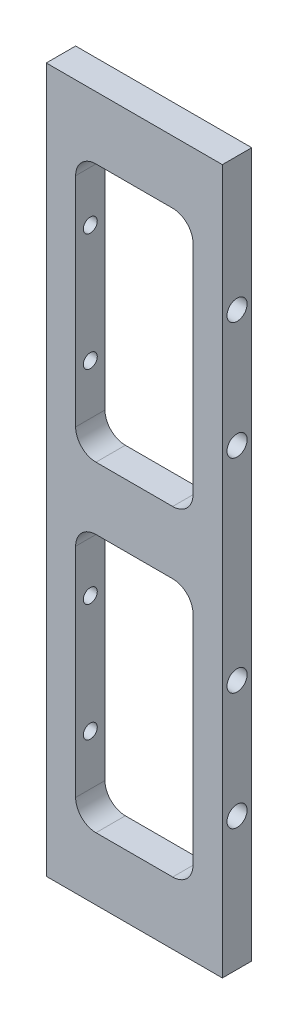
ISO-10303-21;
HEADER;
FILE_DESCRIPTION(('STEP AP214'),'2;1');
FILE_NAME('part.step','',(''),(''),'','','');
FILE_SCHEMA(('AUTOMOTIVE_DESIGN { 1 0 10303 214 1 1 1 1 }'));
ENDSEC;
DATA;
#1=APPLICATION_CONTEXT('core data for automotive mechanical design processes');
#2=APPLICATION_PROTOCOL_DEFINITION('international standard','automotive_design',2000,#1);
#3=PRODUCT_CONTEXT('',#1,'mechanical');
#4=PRODUCT('Part','Part','',(#3));
#5=PRODUCT_RELATED_PRODUCT_CATEGORY('part','',(#4));
#6=PRODUCT_DEFINITION_FORMATION('','',#4);
#7=PRODUCT_DEFINITION_CONTEXT('part definition',#1,'design');
#8=PRODUCT_DEFINITION('design','',#6,#7);
#9=PRODUCT_DEFINITION_SHAPE('','',#8);
#10=(LENGTH_UNIT() NAMED_UNIT(*) SI_UNIT(.MILLI.,.METRE.));
#11=(NAMED_UNIT(*) PLANE_ANGLE_UNIT() SI_UNIT($,.RADIAN.));
#12=(NAMED_UNIT(*) SI_UNIT($,.STERADIAN.) SOLID_ANGLE_UNIT());
#13=UNCERTAINTY_MEASURE_WITH_UNIT(LENGTH_MEASURE(1.E-05),#10,'distance_accuracy_value','');
#14=(GEOMETRIC_REPRESENTATION_CONTEXT(3) GLOBAL_UNCERTAINTY_ASSIGNED_CONTEXT((#13)) GLOBAL_UNIT_ASSIGNED_CONTEXT((#10,
#11,#12)) REPRESENTATION_CONTEXT('',''));
#15=CARTESIAN_POINT('',(0.,0.,0.));
#16=DIRECTION('',(0.,0.,1.));
#17=DIRECTION('',(1.,0.,0.));
#18=AXIS2_PLACEMENT_3D('',#15,#16,#17);
#19=CARTESIAN_POINT('',(14.2875,-57.15,4.7625));
#20=DIRECTION('',(-1.,0.,0.));
#21=DIRECTION('',(0.,0.,1.));
#22=AXIS2_PLACEMENT_3D('',#19,#20,#21);
#23=PLANE('',#22);
#24=DIRECTION('',(0.,1.,0.));
#25=VECTOR('',#24,1.);
#26=CARTESIAN_POINT('',(14.2875,-57.15,0.));
#27=LINE('',#26,#25);
#28=CARTESIAN_POINT('',(14.2875,-57.15,0.));
#29=VERTEX_POINT('',#28);
#30=CARTESIAN_POINT('',(14.2875,57.15,0.));
#31=VERTEX_POINT('',#30);
#32=EDGE_CURVE('E197',#29,#31,#27,.T.);
#33=ORIENTED_EDGE('',*,*,#32,.T.);
#34=DIRECTION('',(0.,0.,-1.));
#35=VECTOR('',#34,1.);
#36=CARTESIAN_POINT('',(14.2875,57.15,4.7625));
#37=LINE('',#36,#35);
#38=CARTESIAN_POINT('',(14.2875,57.15,4.7625));
#39=VERTEX_POINT('',#38);
#40=EDGE_CURVE('E177',#39,#31,#37,.T.);
#41=ORIENTED_EDGE('',*,*,#40,.F.);
#42=DIRECTION('',(0.,1.,0.));
#43=VECTOR('',#42,1.);
#44=CARTESIAN_POINT('',(14.2875,-57.15,4.7625));
#45=LINE('',#44,#43);
#46=CARTESIAN_POINT('',(14.2875,-57.15,4.7625));
#47=VERTEX_POINT('',#46);
#48=EDGE_CURVE('E184',#47,#39,#45,.T.);
#49=ORIENTED_EDGE('',*,*,#48,.F.);
#50=DIRECTION('',(0.,0.,-1.));
#51=VECTOR('',#50,1.);
#52=CARTESIAN_POINT('',(14.2875,-57.15,4.7625));
#53=LINE('',#52,#51);
#54=EDGE_CURVE('E308',#47,#29,#53,.T.);
#55=ORIENTED_EDGE('',*,*,#54,.T.);
#56=EDGE_LOOP('',(#33,#41,#49,#55));
#57=FACE_BOUND('',#56,.T.);
#58=CARTESIAN_POINT('',(14.2875,-35.56,2.38124999999999));
#59=DIRECTION('',(1.,0.,0.));
#60=DIRECTION('',(0.,0.,-1.));
#61=AXIS2_PLACEMENT_3D('',#58,#59,#60);
#62=CIRCLE('',#61,1.63194999999999);
#63=CARTESIAN_POINT('',(14.2875,-35.56,0.749300000000003));
#64=VERTEX_POINT('',#63);
#65=EDGE_CURVE('E410',#64,#64,#62,.T.);
#66=ORIENTED_EDGE('',*,*,#65,.F.);
#67=EDGE_LOOP('',(#66));
#68=FACE_BOUND('',#67,.T.);
#69=CARTESIAN_POINT('',(14.2875,-16.51,2.38124999999999));
#70=DIRECTION('',(1.,0.,0.));
#71=DIRECTION('',(0.,0.,-1.));
#72=AXIS2_PLACEMENT_3D('',#69,#70,#71);
#73=CIRCLE('',#72,1.63194999999999);
#74=CARTESIAN_POINT('',(14.2875,-16.51,0.749300000000003));
#75=VERTEX_POINT('',#74);
#76=EDGE_CURVE('E416',#75,#75,#73,.T.);
#77=ORIENTED_EDGE('',*,*,#76,.F.);
#78=EDGE_LOOP('',(#77));
#79=FACE_BOUND('',#78,.T.);
#80=CARTESIAN_POINT('',(14.2875,16.51,2.38125));
#81=DIRECTION('',(1.,0.,0.));
#82=DIRECTION('',(0.,0.,-1.));
#83=AXIS2_PLACEMENT_3D('',#80,#81,#82);
#84=CIRCLE('',#83,1.63194999999999);
#85=CARTESIAN_POINT('',(14.2875,16.51,0.749300000000006));
#86=VERTEX_POINT('',#85);
#87=EDGE_CURVE('E422',#86,#86,#84,.T.);
#88=ORIENTED_EDGE('',*,*,#87,.F.);
#89=EDGE_LOOP('',(#88));
#90=FACE_BOUND('',#89,.T.);
#91=CARTESIAN_POINT('',(14.2875,35.56,2.38125));
#92=DIRECTION('',(1.,0.,0.));
#93=DIRECTION('',(0.,0.,-1.));
#94=AXIS2_PLACEMENT_3D('',#91,#92,#93);
#95=CIRCLE('',#94,1.63194999999999);
#96=CARTESIAN_POINT('',(14.2875,35.56,0.749300000000011));
#97=VERTEX_POINT('',#96);
#98=EDGE_CURVE('E428',#97,#97,#95,.T.);
#99=ORIENTED_EDGE('',*,*,#98,.F.);
#100=EDGE_LOOP('',(#99));
#101=FACE_BOUND('',#100,.T.);
#102=ADVANCED_FACE('F35',(#57,#68,#79,#90,#101),#23,.F.);
#103=CARTESIAN_POINT('',(-14.2875,57.15,4.7625));
#104=DIRECTION('',(0.,-1.,0.));
#105=DIRECTION('',(0.,0.,-1.));
#106=AXIS2_PLACEMENT_3D('',#103,#104,#105);
#107=PLANE('',#106);
#108=DIRECTION('',(-1.,0.,0.));
#109=VECTOR('',#108,1.);
#110=CARTESIAN_POINT('',(-14.2875,57.15,0.));
#111=LINE('',#110,#109);
#112=CARTESIAN_POINT('',(-14.2875,57.15,0.));
#113=VERTEX_POINT('',#112);
#114=EDGE_CURVE('E310',#31,#113,#111,.T.);
#115=ORIENTED_EDGE('',*,*,#114,.T.);
#116=DIRECTION('',(0.,0.,-1.));
#117=VECTOR('',#116,1.);
#118=CARTESIAN_POINT('',(-14.2875,57.15,4.7625));
#119=LINE('',#118,#117);
#120=CARTESIAN_POINT('',(-14.2875,57.15,4.7625));
#121=VERTEX_POINT('',#120);
#122=EDGE_CURVE('E180',#121,#113,#119,.T.);
#123=ORIENTED_EDGE('',*,*,#122,.F.);
#124=DIRECTION('',(-1.,0.,0.));
#125=VECTOR('',#124,1.);
#126=CARTESIAN_POINT('',(-14.2875,57.15,4.7625));
#127=LINE('',#126,#125);
#128=EDGE_CURVE('E173',#39,#121,#127,.T.);
#129=ORIENTED_EDGE('',*,*,#128,.F.);
#130=ORIENTED_EDGE('',*,*,#40,.T.);
#131=EDGE_LOOP('',(#115,#123,#129,#130));
#132=FACE_BOUND('',#131,.T.);
#133=ADVANCED_FACE('F175',(#132),#107,.F.);
#134=CARTESIAN_POINT('',(-14.2875,-57.15,4.7625));
#135=DIRECTION('',(1.,0.,0.));
#136=DIRECTION('',(0.,0.,-1.));
#137=AXIS2_PLACEMENT_3D('',#134,#135,#136);
#138=PLANE('',#137);
#139=CARTESIAN_POINT('',(-14.2875,16.51,2.38124999999999));
#140=DIRECTION('',(-1.,0.,0.));
#141=DIRECTION('',(0.,0.,1.));
#142=AXIS2_PLACEMENT_3D('',#139,#140,#141);
#143=CIRCLE('',#142,1.13029999999999);
#144=CARTESIAN_POINT('',(-14.2875,16.51,3.51154999999998));
#145=VERTEX_POINT('',#144);
#146=EDGE_CURVE('E452',#145,#145,#143,.T.);
#147=ORIENTED_EDGE('',*,*,#146,.F.);
#148=EDGE_LOOP('',(#147));
#149=FACE_BOUND('',#148,.T.);
#150=CARTESIAN_POINT('',(-14.2875,35.56,2.38124999999999));
#151=DIRECTION('',(-1.,0.,0.));
#152=DIRECTION('',(0.,0.,1.));
#153=AXIS2_PLACEMENT_3D('',#150,#151,#152);
#154=CIRCLE('',#153,1.13029999999999);
#155=CARTESIAN_POINT('',(-14.2875,35.56,3.51154999999998));
#156=VERTEX_POINT('',#155);
#157=EDGE_CURVE('E446',#156,#156,#154,.T.);
#158=ORIENTED_EDGE('',*,*,#157,.F.);
#159=EDGE_LOOP('',(#158));
#160=FACE_BOUND('',#159,.T.);
#161=CARTESIAN_POINT('',(-14.2875,-16.51,2.38125));
#162=DIRECTION('',(-1.,0.,0.));
#163=DIRECTION('',(0.,0.,1.));
#164=AXIS2_PLACEMENT_3D('',#161,#162,#163);
#165=CIRCLE('',#164,1.13029999999999);
#166=CARTESIAN_POINT('',(-14.2875,-16.51,3.51154999999998));
#167=VERTEX_POINT('',#166);
#168=EDGE_CURVE('E440',#167,#167,#165,.T.);
#169=ORIENTED_EDGE('',*,*,#168,.F.);
#170=EDGE_LOOP('',(#169));
#171=FACE_BOUND('',#170,.T.);
#172=CARTESIAN_POINT('',(-14.2875,-35.56,2.38125));
#173=DIRECTION('',(-1.,0.,0.));
#174=DIRECTION('',(0.,0.,1.));
#175=AXIS2_PLACEMENT_3D('',#172,#173,#174);
#176=CIRCLE('',#175,1.13029999999999);
#177=CARTESIAN_POINT('',(-14.2875,-35.56,3.51154999999998));
#178=VERTEX_POINT('',#177);
#179=EDGE_CURVE('E434',#178,#178,#176,.T.);
#180=ORIENTED_EDGE('',*,*,#179,.F.);
#181=EDGE_LOOP('',(#180));
#182=FACE_BOUND('',#181,.T.);
#183=DIRECTION('',(0.,-1.,0.));
#184=VECTOR('',#183,1.);
#185=CARTESIAN_POINT('',(-14.2875,-57.15,0.));
#186=LINE('',#185,#184);
#187=CARTESIAN_POINT('',(-14.2875,-57.15,0.));
#188=VERTEX_POINT('',#187);
#189=EDGE_CURVE('E312',#113,#188,#186,.T.);
#190=ORIENTED_EDGE('',*,*,#189,.T.);
#191=DIRECTION('',(0.,0.,-1.));
#192=VECTOR('',#191,1.);
#193=CARTESIAN_POINT('',(-14.2875,-57.15,4.7625));
#194=LINE('',#193,#192);
#195=CARTESIAN_POINT('',(-14.2875,-57.15,4.7625));
#196=VERTEX_POINT('',#195);
#197=EDGE_CURVE('E202',#196,#188,#194,.T.);
#198=ORIENTED_EDGE('',*,*,#197,.F.);
#199=DIRECTION('',(0.,-1.,0.));
#200=VECTOR('',#199,1.);
#201=CARTESIAN_POINT('',(-14.2875,-57.15,4.7625));
#202=LINE('',#201,#200);
#203=EDGE_CURVE('E183',#121,#196,#202,.T.);
#204=ORIENTED_EDGE('',*,*,#203,.F.);
#205=ORIENTED_EDGE('',*,*,#122,.T.);
#206=EDGE_LOOP('',(#190,#198,#204,#205));
#207=FACE_BOUND('',#206,.T.);
#208=ADVANCED_FACE('F322',(#149,#160,#171,#182,#207),#138,.F.);
#209=CARTESIAN_POINT('',(-14.2875,-57.15,4.7625));
#210=DIRECTION('',(0.,1.,0.));
#211=DIRECTION('',(0.,0.,1.));
#212=AXIS2_PLACEMENT_3D('',#209,#210,#211);
#213=PLANE('',#212);
#214=DIRECTION('',(1.,0.,0.));
#215=VECTOR('',#214,1.);
#216=CARTESIAN_POINT('',(-14.2875,-57.15,0.));
#217=LINE('',#216,#215);
#218=EDGE_CURVE('E193',#188,#29,#217,.T.);
#219=ORIENTED_EDGE('',*,*,#218,.T.);
#220=ORIENTED_EDGE('',*,*,#54,.F.);
#221=DIRECTION('',(1.,0.,0.));
#222=VECTOR('',#221,1.);
#223=CARTESIAN_POINT('',(-14.2875,-57.15,4.7625));
#224=LINE('',#223,#222);
#225=EDGE_CURVE('E189',#196,#47,#224,.T.);
#226=ORIENTED_EDGE('',*,*,#225,.F.);
#227=ORIENTED_EDGE('',*,*,#197,.T.);
#228=EDGE_LOOP('',(#219,#220,#226,#227));
#229=FACE_BOUND('',#228,.T.);
#230=ADVANCED_FACE('F319',(#229),#213,.F.);
#231=CARTESIAN_POINT('',(0.,0.,4.7625));
#232=DIRECTION('',(0.,0.,-1.));
#233=DIRECTION('',(-1.,0.,0.));
#234=AXIS2_PLACEMENT_3D('',#231,#232,#233);
#235=PLANE('',#234);
#236=DIRECTION('',(1.,0.,0.));
#237=VECTOR('',#236,1.);
#238=CARTESIAN_POINT('',(-9.52500000000001,-46.99,4.7625));
#239=LINE('',#238,#237);
#240=CARTESIAN_POINT('',(-6.22300000000001,-46.99,4.7625));
#241=VERTEX_POINT('',#240);
#242=CARTESIAN_POINT('',(6.223,-46.99,4.7625));
#243=VERTEX_POINT('',#242);
#244=EDGE_CURVE('E391',#241,#243,#239,.T.);
#245=ORIENTED_EDGE('',*,*,#244,.F.);
#246=CARTESIAN_POINT('',(-6.22300000000001,-43.688,4.7625));
#247=DIRECTION('',(0.,0.,-1.));
#248=DIRECTION('',(-1.,0.,0.));
#249=AXIS2_PLACEMENT_3D('',#246,#247,#248);
#250=CIRCLE('',#249,3.302);
#251=CARTESIAN_POINT('',(-9.52500000000001,-43.688,4.7625));
#252=VERTEX_POINT('',#251);
#253=EDGE_CURVE('E242',#241,#252,#250,.T.);
#254=ORIENTED_EDGE('',*,*,#253,.T.);
#255=DIRECTION('',(0.,-1.,0.));
#256=VECTOR('',#255,1.);
#257=CARTESIAN_POINT('',(-9.52500000000001,-5.08,4.7625));
#258=LINE('',#257,#256);
#259=CARTESIAN_POINT('',(-9.52500000000001,-8.382,4.7625));
#260=VERTEX_POINT('',#259);
#261=EDGE_CURVE('E394',#260,#252,#258,.T.);
#262=ORIENTED_EDGE('',*,*,#261,.F.);
#263=CARTESIAN_POINT('',(-6.22300000000001,-8.382,4.7625));
#264=DIRECTION('',(0.,0.,-1.));
#265=DIRECTION('',(-1.,0.,0.));
#266=AXIS2_PLACEMENT_3D('',#263,#264,#265);
#267=CIRCLE('',#266,3.302);
#268=CARTESIAN_POINT('',(-6.22300000000001,-5.08,4.7625));
#269=VERTEX_POINT('',#268);
#270=EDGE_CURVE('E250',#260,#269,#267,.T.);
#271=ORIENTED_EDGE('',*,*,#270,.T.);
#272=DIRECTION('',(-1.,0.,0.));
#273=VECTOR('',#272,1.);
#274=CARTESIAN_POINT('',(-9.52500000000001,-5.08,4.7625));
#275=LINE('',#274,#273);
#276=CARTESIAN_POINT('',(6.223,-5.08,4.7625));
#277=VERTEX_POINT('',#276);
#278=EDGE_CURVE('E384',#277,#269,#275,.T.);
#279=ORIENTED_EDGE('',*,*,#278,.F.);
#280=CARTESIAN_POINT('',(6.223,-8.382,4.7625));
#281=DIRECTION('',(0.,0.,-1.));
#282=DIRECTION('',(-1.,0.,0.));
#283=AXIS2_PLACEMENT_3D('',#280,#281,#282);
#284=CIRCLE('',#283,3.302);
#285=CARTESIAN_POINT('',(9.52500000000001,-8.382,4.7625));
#286=VERTEX_POINT('',#285);
#287=EDGE_CURVE('E254',#277,#286,#284,.T.);
#288=ORIENTED_EDGE('',*,*,#287,.T.);
#289=DIRECTION('',(0.,1.,0.));
#290=VECTOR('',#289,1.);
#291=CARTESIAN_POINT('',(9.52500000000001,-5.08,4.7625));
#292=LINE('',#291,#290);
#293=CARTESIAN_POINT('',(9.525,-43.688,4.7625));
#294=VERTEX_POINT('',#293);
#295=EDGE_CURVE('E388',#294,#286,#292,.T.);
#296=ORIENTED_EDGE('',*,*,#295,.F.);
#297=CARTESIAN_POINT('',(6.223,-43.688,4.7625));
#298=DIRECTION('',(0.,0.,-1.));
#299=DIRECTION('',(-1.,0.,0.));
#300=AXIS2_PLACEMENT_3D('',#297,#298,#299);
#301=CIRCLE('',#300,3.302);
#302=EDGE_CURVE('E246',#294,#243,#301,.T.);
#303=ORIENTED_EDGE('',*,*,#302,.T.);
#304=EDGE_LOOP('',(#245,#254,#262,#271,#279,#288,#296,#303));
#305=FACE_BOUND('',#304,.T.);
#306=DIRECTION('',(-1.,0.,0.));
#307=VECTOR('',#306,1.);
#308=CARTESIAN_POINT('',(-9.52500000000001,46.99,4.7625));
#309=LINE('',#308,#307);
#310=CARTESIAN_POINT('',(6.223,46.99,4.7625));
#311=VERTEX_POINT('',#310);
#312=CARTESIAN_POINT('',(-6.22300000000001,46.99,4.7625));
#313=VERTEX_POINT('',#312);
#314=EDGE_CURVE('E271',#311,#313,#309,.T.);
#315=ORIENTED_EDGE('',*,*,#314,.F.);
#316=CARTESIAN_POINT('',(6.223,43.688,4.7625));
#317=DIRECTION('',(0.,0.,-1.));
#318=DIRECTION('',(-1.,0.,0.));
#319=AXIS2_PLACEMENT_3D('',#316,#317,#318);
#320=CIRCLE('',#319,3.302);
#321=CARTESIAN_POINT('',(9.525,43.688,4.7625));
#322=VERTEX_POINT('',#321);
#323=EDGE_CURVE('E266',#311,#322,#320,.T.);
#324=ORIENTED_EDGE('',*,*,#323,.T.);
#325=DIRECTION('',(0.,1.,0.));
#326=VECTOR('',#325,1.);
#327=CARTESIAN_POINT('',(9.52500000000001,5.08,4.7625));
#328=LINE('',#327,#326);
#329=CARTESIAN_POINT('',(9.52500000000001,8.382,4.7625));
#330=VERTEX_POINT('',#329);
#331=EDGE_CURVE('E278',#330,#322,#328,.T.);
#332=ORIENTED_EDGE('',*,*,#331,.F.);
#333=CARTESIAN_POINT('',(6.22300000000001,8.382,4.7625));
#334=DIRECTION('',(0.,0.,-1.));
#335=DIRECTION('',(-1.,0.,0.));
#336=AXIS2_PLACEMENT_3D('',#333,#334,#335);
#337=CIRCLE('',#336,3.302);
#338=CARTESIAN_POINT('',(6.22300000000001,5.08,4.7625));
#339=VERTEX_POINT('',#338);
#340=EDGE_CURVE('E262',#330,#339,#337,.T.);
#341=ORIENTED_EDGE('',*,*,#340,.T.);
#342=DIRECTION('',(1.,0.,0.));
#343=VECTOR('',#342,1.);
#344=CARTESIAN_POINT('',(-9.52500000000001,5.08,4.7625));
#345=LINE('',#344,#343);
#346=CARTESIAN_POINT('',(-6.22300000000001,5.08,4.7625));
#347=VERTEX_POINT('',#346);
#348=EDGE_CURVE('E303',#347,#339,#345,.T.);
#349=ORIENTED_EDGE('',*,*,#348,.F.);
#350=CARTESIAN_POINT('',(-6.22300000000001,8.382,4.7625));
#351=DIRECTION('',(0.,0.,-1.));
#352=DIRECTION('',(-1.,0.,0.));
#353=AXIS2_PLACEMENT_3D('',#350,#351,#352);
#354=CIRCLE('',#353,3.302);
#355=CARTESIAN_POINT('',(-9.52500000000001,8.382,4.7625));
#356=VERTEX_POINT('',#355);
#357=EDGE_CURVE('E258',#347,#356,#354,.T.);
#358=ORIENTED_EDGE('',*,*,#357,.T.);
#359=DIRECTION('',(0.,-1.,0.));
#360=VECTOR('',#359,1.);
#361=CARTESIAN_POINT('',(-9.52500000000001,5.08,4.7625));
#362=LINE('',#361,#360);
#363=CARTESIAN_POINT('',(-9.52500000000001,43.688,4.7625));
#364=VERTEX_POINT('',#363);
#365=EDGE_CURVE('E273',#364,#356,#362,.T.);
#366=ORIENTED_EDGE('',*,*,#365,.F.);
#367=CARTESIAN_POINT('',(-6.22300000000001,43.688,4.7625));
#368=DIRECTION('',(0.,0.,-1.));
#369=DIRECTION('',(-1.,0.,0.));
#370=AXIS2_PLACEMENT_3D('',#367,#368,#369);
#371=CIRCLE('',#370,3.302);
#372=EDGE_CURVE('E43',#364,#313,#371,.T.);
#373=ORIENTED_EDGE('',*,*,#372,.T.);
#374=EDGE_LOOP('',(#315,#324,#332,#341,#349,#358,#366,#373));
#375=FACE_BOUND('',#374,.T.);
#376=ORIENTED_EDGE('',*,*,#48,.T.);
#377=ORIENTED_EDGE('',*,*,#128,.T.);
#378=ORIENTED_EDGE('',*,*,#203,.T.);
#379=ORIENTED_EDGE('',*,*,#225,.T.);
#380=EDGE_LOOP('',(#376,#377,#378,#379));
#381=FACE_BOUND('',#380,.T.);
#382=ADVANCED_FACE('F187',(#305,#375,#381),#235,.F.);
#383=CARTESIAN_POINT('',(0.,0.,0.));
#384=DIRECTION('',(0.,0.,-1.));
#385=DIRECTION('',(-1.,0.,0.));
#386=AXIS2_PLACEMENT_3D('',#383,#384,#385);
#387=PLANE('',#386);
#388=DIRECTION('',(-1.,0.,0.));
#389=VECTOR('',#388,1.);
#390=CARTESIAN_POINT('',(-9.52500000000001,-5.08,0.));
#391=LINE('',#390,#389);
#392=CARTESIAN_POINT('',(6.223,-5.08,0.));
#393=VERTEX_POINT('',#392);
#394=CARTESIAN_POINT('',(-6.22300000000001,-5.08,0.));
#395=VERTEX_POINT('',#394);
#396=EDGE_CURVE('E300',#393,#395,#391,.T.);
#397=ORIENTED_EDGE('',*,*,#396,.T.);
#398=CARTESIAN_POINT('',(-6.22300000000001,-8.382,0.));
#399=DIRECTION('',(0.,0.,-1.));
#400=DIRECTION('',(-1.,0.,0.));
#401=AXIS2_PLACEMENT_3D('',#398,#399,#400);
#402=CIRCLE('',#401,3.302);
#403=CARTESIAN_POINT('',(-9.52500000000001,-8.382,0.));
#404=VERTEX_POINT('',#403);
#405=EDGE_CURVE('E252',#395,#404,#402,.F.);
#406=ORIENTED_EDGE('',*,*,#405,.T.);
#407=DIRECTION('',(0.,-1.,0.));
#408=VECTOR('',#407,1.);
#409=CARTESIAN_POINT('',(-9.52500000000001,-5.08,0.));
#410=LINE('',#409,#408);
#411=CARTESIAN_POINT('',(-9.52500000000001,-43.688,0.));
#412=VERTEX_POINT('',#411);
#413=EDGE_CURVE('E387',#404,#412,#410,.T.);
#414=ORIENTED_EDGE('',*,*,#413,.T.);
#415=CARTESIAN_POINT('',(-6.22300000000001,-43.688,0.));
#416=DIRECTION('',(0.,0.,-1.));
#417=DIRECTION('',(-1.,0.,0.));
#418=AXIS2_PLACEMENT_3D('',#415,#416,#417);
#419=CIRCLE('',#418,3.302);
#420=CARTESIAN_POINT('',(-6.22300000000001,-46.99,0.));
#421=VERTEX_POINT('',#420);
#422=EDGE_CURVE('E244',#412,#421,#419,.F.);
#423=ORIENTED_EDGE('',*,*,#422,.T.);
#424=DIRECTION('',(1.,0.,0.));
#425=VECTOR('',#424,1.);
#426=CARTESIAN_POINT('',(-9.52500000000001,-46.99,0.));
#427=LINE('',#426,#425);
#428=CARTESIAN_POINT('',(6.223,-46.99,0.));
#429=VERTEX_POINT('',#428);
#430=EDGE_CURVE('E403',#421,#429,#427,.T.);
#431=ORIENTED_EDGE('',*,*,#430,.T.);
#432=CARTESIAN_POINT('',(6.223,-43.688,0.));
#433=DIRECTION('',(0.,0.,-1.));
#434=DIRECTION('',(-1.,0.,0.));
#435=AXIS2_PLACEMENT_3D('',#432,#433,#434);
#436=CIRCLE('',#435,3.302);
#437=CARTESIAN_POINT('',(9.525,-43.688,0.));
#438=VERTEX_POINT('',#437);
#439=EDGE_CURVE('E248',#429,#438,#436,.F.);
#440=ORIENTED_EDGE('',*,*,#439,.T.);
#441=DIRECTION('',(0.,1.,0.));
#442=VECTOR('',#441,1.);
#443=CARTESIAN_POINT('',(9.52500000000001,-5.08,0.));
#444=LINE('',#443,#442);
#445=CARTESIAN_POINT('',(9.52500000000001,-8.382,0.));
#446=VERTEX_POINT('',#445);
#447=EDGE_CURVE('E400',#438,#446,#444,.T.);
#448=ORIENTED_EDGE('',*,*,#447,.T.);
#449=CARTESIAN_POINT('',(6.223,-8.382,0.));
#450=DIRECTION('',(0.,0.,-1.));
#451=DIRECTION('',(-1.,0.,0.));
#452=AXIS2_PLACEMENT_3D('',#449,#450,#451);
#453=CIRCLE('',#452,3.302);
#454=EDGE_CURVE('E256',#446,#393,#453,.F.);
#455=ORIENTED_EDGE('',*,*,#454,.T.);
#456=EDGE_LOOP('',(#397,#406,#414,#423,#431,#440,#448,#455));
#457=FACE_BOUND('',#456,.T.);
#458=DIRECTION('',(1.,0.,0.));
#459=VECTOR('',#458,1.);
#460=CARTESIAN_POINT('',(-9.52500000000001,5.08,0.));
#461=LINE('',#460,#459);
#462=CARTESIAN_POINT('',(-6.22300000000001,5.08,0.));
#463=VERTEX_POINT('',#462);
#464=CARTESIAN_POINT('',(6.22300000000001,5.08,0.));
#465=VERTEX_POINT('',#464);
#466=EDGE_CURVE('E292',#463,#465,#461,.T.);
#467=ORIENTED_EDGE('',*,*,#466,.T.);
#468=CARTESIAN_POINT('',(6.22300000000001,8.382,0.));
#469=DIRECTION('',(0.,0.,-1.));
#470=DIRECTION('',(-1.,0.,0.));
#471=AXIS2_PLACEMENT_3D('',#468,#469,#470);
#472=CIRCLE('',#471,3.302);
#473=CARTESIAN_POINT('',(9.52500000000001,8.382,0.));
#474=VERTEX_POINT('',#473);
#475=EDGE_CURVE('E264',#465,#474,#472,.F.);
#476=ORIENTED_EDGE('',*,*,#475,.T.);
#477=DIRECTION('',(0.,1.,0.));
#478=VECTOR('',#477,1.);
#479=CARTESIAN_POINT('',(9.52500000000001,5.08,0.));
#480=LINE('',#479,#478);
#481=CARTESIAN_POINT('',(9.525,43.688,0.));
#482=VERTEX_POINT('',#481);
#483=EDGE_CURVE('E295',#474,#482,#480,.T.);
#484=ORIENTED_EDGE('',*,*,#483,.T.);
#485=CARTESIAN_POINT('',(6.223,43.688,0.));
#486=DIRECTION('',(0.,0.,-1.));
#487=DIRECTION('',(-1.,0.,0.));
#488=AXIS2_PLACEMENT_3D('',#485,#486,#487);
#489=CIRCLE('',#488,3.302);
#490=CARTESIAN_POINT('',(6.223,46.99,0.));
#491=VERTEX_POINT('',#490);
#492=EDGE_CURVE('E57',#482,#491,#489,.F.);
#493=ORIENTED_EDGE('',*,*,#492,.T.);
#494=DIRECTION('',(-1.,0.,0.));
#495=VECTOR('',#494,1.);
#496=CARTESIAN_POINT('',(-9.52500000000001,46.99,0.));
#497=LINE('',#496,#495);
#498=CARTESIAN_POINT('',(-6.22300000000001,46.99,0.));
#499=VERTEX_POINT('',#498);
#500=EDGE_CURVE('E288',#491,#499,#497,.T.);
#501=ORIENTED_EDGE('',*,*,#500,.T.);
#502=CARTESIAN_POINT('',(-6.22300000000001,43.688,0.));
#503=DIRECTION('',(0.,0.,-1.));
#504=DIRECTION('',(-1.,0.,0.));
#505=AXIS2_PLACEMENT_3D('',#502,#503,#504);
#506=CIRCLE('',#505,3.302);
#507=CARTESIAN_POINT('',(-9.52500000000001,43.688,0.));
#508=VERTEX_POINT('',#507);
#509=EDGE_CURVE('E11',#499,#508,#506,.F.);
#510=ORIENTED_EDGE('',*,*,#509,.T.);
#511=DIRECTION('',(0.,-1.,0.));
#512=VECTOR('',#511,1.);
#513=CARTESIAN_POINT('',(-9.52500000000001,5.08,0.));
#514=LINE('',#513,#512);
#515=CARTESIAN_POINT('',(-9.52500000000001,8.382,0.));
#516=VERTEX_POINT('',#515);
#517=EDGE_CURVE('E286',#508,#516,#514,.T.);
#518=ORIENTED_EDGE('',*,*,#517,.T.);
#519=CARTESIAN_POINT('',(-6.22300000000001,8.382,0.));
#520=DIRECTION('',(0.,0.,-1.));
#521=DIRECTION('',(-1.,0.,0.));
#522=AXIS2_PLACEMENT_3D('',#519,#520,#521);
#523=CIRCLE('',#522,3.302);
#524=EDGE_CURVE('E260',#516,#463,#523,.F.);
#525=ORIENTED_EDGE('',*,*,#524,.T.);
#526=EDGE_LOOP('',(#467,#476,#484,#493,#501,#510,#518,#525));
#527=FACE_BOUND('',#526,.T.);
#528=ORIENTED_EDGE('',*,*,#32,.F.);
#529=ORIENTED_EDGE('',*,*,#218,.F.);
#530=ORIENTED_EDGE('',*,*,#189,.F.);
#531=ORIENTED_EDGE('',*,*,#114,.F.);
#532=EDGE_LOOP('',(#528,#529,#530,#531));
#533=FACE_BOUND('',#532,.T.);
#534=ADVANCED_FACE('F284',(#457,#527,#533),#387,.T.);
#535=CARTESIAN_POINT('',(9.52500000000001,5.08,0.));
#536=DIRECTION('',(1.,0.,0.));
#537=DIRECTION('',(0.,1.,0.));
#538=AXIS2_PLACEMENT_3D('',#535,#536,#537);
#539=PLANE('',#538);
#540=CARTESIAN_POINT('',(9.525,35.56,2.38125));
#541=DIRECTION('',(1.,0.,0.));
#542=DIRECTION('',(0.,1.,0.));
#543=AXIS2_PLACEMENT_3D('',#540,#541,#542);
#544=CIRCLE('',#543,1.63194999999999);
#545=CARTESIAN_POINT('',(9.525,37.19195,2.38125));
#546=VERTEX_POINT('',#545);
#547=EDGE_CURVE('E425',#546,#546,#544,.T.);
#548=ORIENTED_EDGE('',*,*,#547,.T.);
#549=EDGE_LOOP('',(#548));
#550=FACE_BOUND('',#549,.T.);
#551=CARTESIAN_POINT('',(9.52500000000001,16.51,2.38125));
#552=DIRECTION('',(1.,0.,0.));
#553=DIRECTION('',(0.,1.,0.));
#554=AXIS2_PLACEMENT_3D('',#551,#552,#553);
#555=CIRCLE('',#554,1.63194999999999);
#556=CARTESIAN_POINT('',(9.52500000000001,18.14195,2.38125));
#557=VERTEX_POINT('',#556);
#558=EDGE_CURVE('E419',#557,#557,#555,.T.);
#559=ORIENTED_EDGE('',*,*,#558,.T.);
#560=EDGE_LOOP('',(#559));
#561=FACE_BOUND('',#560,.T.);
#562=ORIENTED_EDGE('',*,*,#483,.F.);
#563=DIRECTION('',(0.,0.,1.));
#564=VECTOR('',#563,1.);
#565=CARTESIAN_POINT('',(9.52500000000001,8.382,4.7625));
#566=LINE('',#565,#564);
#567=EDGE_CURVE('E235',#474,#330,#566,.T.);
#568=ORIENTED_EDGE('',*,*,#567,.T.);
#569=ORIENTED_EDGE('',*,*,#331,.T.);
#570=DIRECTION('',(0.,0.,1.));
#571=VECTOR('',#570,1.);
#572=CARTESIAN_POINT('',(9.525,43.688,0.));
#573=LINE('',#572,#571);
#574=EDGE_CURVE('E233',#322,#482,#573,.F.);
#575=ORIENTED_EDGE('',*,*,#574,.T.);
#576=EDGE_LOOP('',(#562,#568,#569,#575));
#577=FACE_BOUND('',#576,.T.);
#578=ADVANCED_FACE('F374',(#550,#561,#577),#539,.F.);
#579=CARTESIAN_POINT('',(-9.52500000000001,5.08,0.));
#580=DIRECTION('',(0.,-1.,0.));
#581=DIRECTION('',(0.,0.,-1.));
#582=AXIS2_PLACEMENT_3D('',#579,#580,#581);
#583=PLANE('',#582);
#584=ORIENTED_EDGE('',*,*,#466,.F.);
#585=DIRECTION('',(0.,0.,1.));
#586=VECTOR('',#585,1.);
#587=CARTESIAN_POINT('',(-6.22300000000001,5.08,4.7625));
#588=LINE('',#587,#586);
#589=EDGE_CURVE('E225',#463,#347,#588,.T.);
#590=ORIENTED_EDGE('',*,*,#589,.T.);
#591=ORIENTED_EDGE('',*,*,#348,.T.);
#592=DIRECTION('',(0.,0.,1.));
#593=VECTOR('',#592,1.);
#594=CARTESIAN_POINT('',(6.22300000000001,5.08,0.));
#595=LINE('',#594,#593);
#596=EDGE_CURVE('E223',#339,#465,#595,.F.);
#597=ORIENTED_EDGE('',*,*,#596,.T.);
#598=EDGE_LOOP('',(#584,#590,#591,#597));
#599=FACE_BOUND('',#598,.T.);
#600=ADVANCED_FACE('F381',(#599),#583,.F.);
#601=CARTESIAN_POINT('',(-9.52500000000001,5.08,0.));
#602=DIRECTION('',(-1.,0.,0.));
#603=DIRECTION('',(0.,-1.,0.));
#604=AXIS2_PLACEMENT_3D('',#601,#602,#603);
#605=PLANE('',#604);
#606=CARTESIAN_POINT('',(-9.52500000000001,16.51,2.38124999999999));
#607=DIRECTION('',(-1.,0.,0.));
#608=DIRECTION('',(0.,-1.,0.));
#609=AXIS2_PLACEMENT_3D('',#606,#607,#608);
#610=CIRCLE('',#609,1.13029999999999);
#611=CARTESIAN_POINT('',(-9.52500000000001,15.3797,2.38124999999999));
#612=VERTEX_POINT('',#611);
#613=EDGE_CURVE('E449',#612,#612,#610,.T.);
#614=ORIENTED_EDGE('',*,*,#613,.T.);
#615=EDGE_LOOP('',(#614));
#616=FACE_BOUND('',#615,.T.);
#617=CARTESIAN_POINT('',(-9.52500000000001,35.56,2.38124999999999));
#618=DIRECTION('',(-1.,0.,0.));
#619=DIRECTION('',(0.,-1.,0.));
#620=AXIS2_PLACEMENT_3D('',#617,#618,#619);
#621=CIRCLE('',#620,1.13029999999999);
#622=CARTESIAN_POINT('',(-9.52500000000001,34.4297,2.38124999999999));
#623=VERTEX_POINT('',#622);
#624=EDGE_CURVE('E443',#623,#623,#621,.T.);
#625=ORIENTED_EDGE('',*,*,#624,.T.);
#626=EDGE_LOOP('',(#625));
#627=FACE_BOUND('',#626,.T.);
#628=ORIENTED_EDGE('',*,*,#365,.T.);
#629=DIRECTION('',(0.,0.,1.));
#630=VECTOR('',#629,1.);
#631=CARTESIAN_POINT('',(-9.52500000000001,8.382,0.));
#632=LINE('',#631,#630);
#633=EDGE_CURVE('E231',#356,#516,#632,.F.);
#634=ORIENTED_EDGE('',*,*,#633,.T.);
#635=ORIENTED_EDGE('',*,*,#517,.F.);
#636=DIRECTION('',(0.,0.,1.));
#637=VECTOR('',#636,1.);
#638=CARTESIAN_POINT('',(-9.52500000000001,43.688,4.7625));
#639=LINE('',#638,#637);
#640=EDGE_CURVE('E228',#508,#364,#639,.T.);
#641=ORIENTED_EDGE('',*,*,#640,.T.);
#642=EDGE_LOOP('',(#628,#634,#635,#641));
#643=FACE_BOUND('',#642,.T.);
#644=ADVANCED_FACE('F290',(#616,#627,#643),#605,.F.);
#645=CARTESIAN_POINT('',(-9.52500000000001,46.99,0.));
#646=DIRECTION('',(0.,1.,0.));
#647=DIRECTION('',(0.,0.,1.));
#648=AXIS2_PLACEMENT_3D('',#645,#646,#647);
#649=PLANE('',#648);
#650=ORIENTED_EDGE('',*,*,#500,.F.);
#651=DIRECTION('',(0.,0.,1.));
#652=VECTOR('',#651,1.);
#653=CARTESIAN_POINT('',(6.223,46.99,4.7625));
#654=LINE('',#653,#652);
#655=EDGE_CURVE('E239',#491,#311,#654,.T.);
#656=ORIENTED_EDGE('',*,*,#655,.T.);
#657=ORIENTED_EDGE('',*,*,#314,.T.);
#658=DIRECTION('',(0.,0.,1.));
#659=VECTOR('',#658,1.);
#660=CARTESIAN_POINT('',(-6.22300000000001,46.99,0.));
#661=LINE('',#660,#659);
#662=EDGE_CURVE('E50',#313,#499,#661,.F.);
#663=ORIENTED_EDGE('',*,*,#662,.T.);
#664=EDGE_LOOP('',(#650,#656,#657,#663));
#665=FACE_BOUND('',#664,.T.);
#666=ADVANCED_FACE('F276',(#665),#649,.F.);
#667=CARTESIAN_POINT('',(-9.52500000000001,-5.08,0.));
#668=DIRECTION('',(-1.,0.,0.));
#669=DIRECTION('',(0.,-1.,0.));
#670=AXIS2_PLACEMENT_3D('',#667,#668,#669);
#671=PLANE('',#670);
#672=CARTESIAN_POINT('',(-9.52500000000001,-16.51,2.38125));
#673=DIRECTION('',(-1.,0.,0.));
#674=DIRECTION('',(0.,-1.,0.));
#675=AXIS2_PLACEMENT_3D('',#672,#673,#674);
#676=CIRCLE('',#675,1.13029999999999);
#677=CARTESIAN_POINT('',(-9.52500000000001,-17.6403,2.38125));
#678=VERTEX_POINT('',#677);
#679=EDGE_CURVE('E437',#678,#678,#676,.T.);
#680=ORIENTED_EDGE('',*,*,#679,.T.);
#681=EDGE_LOOP('',(#680));
#682=FACE_BOUND('',#681,.T.);
#683=CARTESIAN_POINT('',(-9.52500000000001,-35.56,2.38125));
#684=DIRECTION('',(-1.,0.,0.));
#685=DIRECTION('',(0.,-1.,0.));
#686=AXIS2_PLACEMENT_3D('',#683,#684,#685);
#687=CIRCLE('',#686,1.13029999999999);
#688=CARTESIAN_POINT('',(-9.52500000000001,-36.6903,2.38125));
#689=VERTEX_POINT('',#688);
#690=EDGE_CURVE('E431',#689,#689,#687,.T.);
#691=ORIENTED_EDGE('',*,*,#690,.T.);
#692=EDGE_LOOP('',(#691));
#693=FACE_BOUND('',#692,.T.);
#694=ORIENTED_EDGE('',*,*,#261,.T.);
#695=DIRECTION('',(0.,0.,1.));
#696=VECTOR('',#695,1.);
#697=CARTESIAN_POINT('',(-9.52500000000001,-43.688,0.));
#698=LINE('',#697,#696);
#699=EDGE_CURVE('E211',#252,#412,#698,.F.);
#700=ORIENTED_EDGE('',*,*,#699,.T.);
#701=ORIENTED_EDGE('',*,*,#413,.F.);
#702=DIRECTION('',(0.,0.,1.));
#703=VECTOR('',#702,1.);
#704=CARTESIAN_POINT('',(-9.52500000000001,-8.382,4.7625));
#705=LINE('',#704,#703);
#706=EDGE_CURVE('E208',#404,#260,#705,.T.);
#707=ORIENTED_EDGE('',*,*,#706,.T.);
#708=EDGE_LOOP('',(#694,#700,#701,#707));
#709=FACE_BOUND('',#708,.T.);
#710=ADVANCED_FACE('F494',(#682,#693,#709),#671,.F.);
#711=CARTESIAN_POINT('',(-9.52500000000001,-5.08,0.));
#712=DIRECTION('',(0.,1.,0.));
#713=DIRECTION('',(0.,0.,1.));
#714=AXIS2_PLACEMENT_3D('',#711,#712,#713);
#715=PLANE('',#714);
#716=ORIENTED_EDGE('',*,*,#278,.T.);
#717=DIRECTION('',(0.,0.,1.));
#718=VECTOR('',#717,1.);
#719=CARTESIAN_POINT('',(-6.22300000000001,-5.08,0.));
#720=LINE('',#719,#718);
#721=EDGE_CURVE('E221',#269,#395,#720,.F.);
#722=ORIENTED_EDGE('',*,*,#721,.T.);
#723=ORIENTED_EDGE('',*,*,#396,.F.);
#724=DIRECTION('',(0.,0.,1.));
#725=VECTOR('',#724,1.);
#726=CARTESIAN_POINT('',(6.223,-5.08,4.7625));
#727=LINE('',#726,#725);
#728=EDGE_CURVE('E218',#393,#277,#727,.T.);
#729=ORIENTED_EDGE('',*,*,#728,.T.);
#730=EDGE_LOOP('',(#716,#722,#723,#729));
#731=FACE_BOUND('',#730,.T.);
#732=ADVANCED_FACE('F490',(#731),#715,.F.);
#733=CARTESIAN_POINT('',(9.52500000000001,-5.08,0.));
#734=DIRECTION('',(1.,0.,0.));
#735=DIRECTION('',(0.,1.,0.));
#736=AXIS2_PLACEMENT_3D('',#733,#734,#735);
#737=PLANE('',#736);
#738=CARTESIAN_POINT('',(9.52500000000001,-16.51,2.38124999999999));
#739=DIRECTION('',(1.,0.,0.));
#740=DIRECTION('',(0.,1.,0.));
#741=AXIS2_PLACEMENT_3D('',#738,#739,#740);
#742=CIRCLE('',#741,1.63194999999999);
#743=CARTESIAN_POINT('',(9.52500000000001,-14.87805,2.38124999999999));
#744=VERTEX_POINT('',#743);
#745=EDGE_CURVE('E413',#744,#744,#742,.T.);
#746=ORIENTED_EDGE('',*,*,#745,.T.);
#747=EDGE_LOOP('',(#746));
#748=FACE_BOUND('',#747,.T.);
#749=CARTESIAN_POINT('',(9.525,-35.56,2.38124999999999));
#750=DIRECTION('',(1.,0.,0.));
#751=DIRECTION('',(0.,1.,0.));
#752=AXIS2_PLACEMENT_3D('',#749,#750,#751);
#753=CIRCLE('',#752,1.63194999999999);
#754=CARTESIAN_POINT('',(9.525,-33.92805,2.38124999999999));
#755=VERTEX_POINT('',#754);
#756=EDGE_CURVE('E397',#755,#755,#753,.T.);
#757=ORIENTED_EDGE('',*,*,#756,.T.);
#758=EDGE_LOOP('',(#757));
#759=FACE_BOUND('',#758,.T.);
#760=ORIENTED_EDGE('',*,*,#447,.F.);
#761=DIRECTION('',(0.,0.,1.));
#762=VECTOR('',#761,1.);
#763=CARTESIAN_POINT('',(9.525,-43.688,4.7625));
#764=LINE('',#763,#762);
#765=EDGE_CURVE('E215',#438,#294,#764,.T.);
#766=ORIENTED_EDGE('',*,*,#765,.T.);
#767=ORIENTED_EDGE('',*,*,#295,.T.);
#768=DIRECTION('',(0.,0.,1.));
#769=VECTOR('',#768,1.);
#770=CARTESIAN_POINT('',(9.52500000000001,-8.382,0.));
#771=LINE('',#770,#769);
#772=EDGE_CURVE('E213',#286,#446,#771,.F.);
#773=ORIENTED_EDGE('',*,*,#772,.T.);
#774=EDGE_LOOP('',(#760,#766,#767,#773));
#775=FACE_BOUND('',#774,.T.);
#776=ADVANCED_FACE('F493',(#748,#759,#775),#737,.F.);
#777=CARTESIAN_POINT('',(-9.52500000000001,-46.99,0.));
#778=DIRECTION('',(0.,-1.,0.));
#779=DIRECTION('',(0.,0.,-1.));
#780=AXIS2_PLACEMENT_3D('',#777,#778,#779);
#781=PLANE('',#780);
#782=ORIENTED_EDGE('',*,*,#430,.F.);
#783=DIRECTION('',(0.,0.,1.));
#784=VECTOR('',#783,1.);
#785=CARTESIAN_POINT('',(-6.22300000000001,-46.99,4.7625));
#786=LINE('',#785,#784);
#787=EDGE_CURVE('E200',#421,#241,#786,.T.);
#788=ORIENTED_EDGE('',*,*,#787,.T.);
#789=ORIENTED_EDGE('',*,*,#244,.T.);
#790=DIRECTION('',(0.,0.,1.));
#791=VECTOR('',#790,1.);
#792=CARTESIAN_POINT('',(6.223,-46.99,0.));
#793=LINE('',#792,#791);
#794=EDGE_CURVE('E198',#243,#429,#793,.F.);
#795=ORIENTED_EDGE('',*,*,#794,.T.);
#796=EDGE_LOOP('',(#782,#788,#789,#795));
#797=FACE_BOUND('',#796,.T.);
#798=ADVANCED_FACE('F343',(#797),#781,.F.);
#799=CARTESIAN_POINT('',(-6.22300000000001,-43.688,0.));
#800=DIRECTION('',(0.,0.,-1.));
#801=DIRECTION('',(-1.,0.,0.));
#802=AXIS2_PLACEMENT_3D('',#799,#800,#801);
#803=CYLINDRICAL_SURFACE('',#802,3.302);
#804=ORIENTED_EDGE('',*,*,#422,.F.);
#805=ORIENTED_EDGE('',*,*,#699,.F.);
#806=ORIENTED_EDGE('',*,*,#253,.F.);
#807=ORIENTED_EDGE('',*,*,#787,.F.);
#808=EDGE_LOOP('',(#804,#805,#806,#807));
#809=FACE_BOUND('',#808,.T.);
#810=ADVANCED_FACE('F339',(#809),#803,.F.);
#811=CARTESIAN_POINT('',(6.223,-43.688,0.));
#812=DIRECTION('',(0.,0.,-1.));
#813=DIRECTION('',(-1.,0.,0.));
#814=AXIS2_PLACEMENT_3D('',#811,#812,#813);
#815=CYLINDRICAL_SURFACE('',#814,3.302);
#816=ORIENTED_EDGE('',*,*,#439,.F.);
#817=ORIENTED_EDGE('',*,*,#794,.F.);
#818=ORIENTED_EDGE('',*,*,#302,.F.);
#819=ORIENTED_EDGE('',*,*,#765,.F.);
#820=EDGE_LOOP('',(#816,#817,#818,#819));
#821=FACE_BOUND('',#820,.T.);
#822=ADVANCED_FACE('F342',(#821),#815,.F.);
#823=CARTESIAN_POINT('',(-6.22300000000001,-8.382,0.));
#824=DIRECTION('',(0.,0.,-1.));
#825=DIRECTION('',(-1.,0.,0.));
#826=AXIS2_PLACEMENT_3D('',#823,#824,#825);
#827=CYLINDRICAL_SURFACE('',#826,3.302);
#828=ORIENTED_EDGE('',*,*,#405,.F.);
#829=ORIENTED_EDGE('',*,*,#721,.F.);
#830=ORIENTED_EDGE('',*,*,#270,.F.);
#831=ORIENTED_EDGE('',*,*,#706,.F.);
#832=EDGE_LOOP('',(#828,#829,#830,#831));
#833=FACE_BOUND('',#832,.T.);
#834=ADVANCED_FACE('F347',(#833),#827,.F.);
#835=CARTESIAN_POINT('',(6.223,-8.382,0.));
#836=DIRECTION('',(0.,0.,-1.));
#837=DIRECTION('',(-1.,0.,0.));
#838=AXIS2_PLACEMENT_3D('',#835,#836,#837);
#839=CYLINDRICAL_SURFACE('',#838,3.302);
#840=ORIENTED_EDGE('',*,*,#454,.F.);
#841=ORIENTED_EDGE('',*,*,#772,.F.);
#842=ORIENTED_EDGE('',*,*,#287,.F.);
#843=ORIENTED_EDGE('',*,*,#728,.F.);
#844=EDGE_LOOP('',(#840,#841,#842,#843));
#845=FACE_BOUND('',#844,.T.);
#846=ADVANCED_FACE('F351',(#845),#839,.F.);
#847=CARTESIAN_POINT('',(-6.22300000000001,8.382,0.));
#848=DIRECTION('',(0.,0.,-1.));
#849=DIRECTION('',(-1.,0.,0.));
#850=AXIS2_PLACEMENT_3D('',#847,#848,#849);
#851=CYLINDRICAL_SURFACE('',#850,3.302);
#852=ORIENTED_EDGE('',*,*,#524,.F.);
#853=ORIENTED_EDGE('',*,*,#633,.F.);
#854=ORIENTED_EDGE('',*,*,#357,.F.);
#855=ORIENTED_EDGE('',*,*,#589,.F.);
#856=EDGE_LOOP('',(#852,#853,#854,#855));
#857=FACE_BOUND('',#856,.T.);
#858=ADVANCED_FACE('F355',(#857),#851,.F.);
#859=CARTESIAN_POINT('',(6.22300000000001,8.382,0.));
#860=DIRECTION('',(0.,0.,-1.));
#861=DIRECTION('',(-1.,0.,0.));
#862=AXIS2_PLACEMENT_3D('',#859,#860,#861);
#863=CYLINDRICAL_SURFACE('',#862,3.302);
#864=ORIENTED_EDGE('',*,*,#475,.F.);
#865=ORIENTED_EDGE('',*,*,#596,.F.);
#866=ORIENTED_EDGE('',*,*,#340,.F.);
#867=ORIENTED_EDGE('',*,*,#567,.F.);
#868=EDGE_LOOP('',(#864,#865,#866,#867));
#869=FACE_BOUND('',#868,.T.);
#870=ADVANCED_FACE('F359',(#869),#863,.F.);
#871=CARTESIAN_POINT('',(6.223,43.688,0.));
#872=DIRECTION('',(0.,0.,-1.));
#873=DIRECTION('',(-1.,0.,0.));
#874=AXIS2_PLACEMENT_3D('',#871,#872,#873);
#875=CYLINDRICAL_SURFACE('',#874,3.302);
#876=ORIENTED_EDGE('',*,*,#492,.F.);
#877=ORIENTED_EDGE('',*,*,#574,.F.);
#878=ORIENTED_EDGE('',*,*,#323,.F.);
#879=ORIENTED_EDGE('',*,*,#655,.F.);
#880=EDGE_LOOP('',(#876,#877,#878,#879));
#881=FACE_BOUND('',#880,.T.);
#882=ADVANCED_FACE('F362',(#881),#875,.F.);
#883=CARTESIAN_POINT('',(-6.22300000000001,43.688,0.));
#884=DIRECTION('',(0.,0.,-1.));
#885=DIRECTION('',(-1.,0.,0.));
#886=AXIS2_PLACEMENT_3D('',#883,#884,#885);
#887=CYLINDRICAL_SURFACE('',#886,3.302);
#888=ORIENTED_EDGE('',*,*,#509,.F.);
#889=ORIENTED_EDGE('',*,*,#662,.F.);
#890=ORIENTED_EDGE('',*,*,#372,.F.);
#891=ORIENTED_EDGE('',*,*,#640,.F.);
#892=EDGE_LOOP('',(#888,#889,#890,#891));
#893=FACE_BOUND('',#892,.T.);
#894=ADVANCED_FACE('F37',(#893),#887,.F.);
#895=CARTESIAN_POINT('',(14.2875,-35.56,2.38124999999999));
#896=DIRECTION('',(1.,0.,0.));
#897=DIRECTION('',(0.,0.,-1.));
#898=AXIS2_PLACEMENT_3D('',#895,#896,#897);
#899=CYLINDRICAL_SURFACE('',#898,1.63194999999999);
#900=ORIENTED_EDGE('',*,*,#756,.F.);
#901=EDGE_LOOP('',(#900));
#902=FACE_BOUND('',#901,.T.);
#903=ORIENTED_EDGE('',*,*,#65,.T.);
#904=EDGE_LOOP('',(#903));
#905=FACE_BOUND('',#904,.T.);
#906=ADVANCED_FACE('F369',(#902,#905),#899,.F.);
#907=CARTESIAN_POINT('',(14.2875,-16.51,2.38124999999999));
#908=DIRECTION('',(1.,0.,0.));
#909=DIRECTION('',(0.,0.,-1.));
#910=AXIS2_PLACEMENT_3D('',#907,#908,#909);
#911=CYLINDRICAL_SURFACE('',#910,1.63194999999999);
#912=ORIENTED_EDGE('',*,*,#745,.F.);
#913=EDGE_LOOP('',(#912));
#914=FACE_BOUND('',#913,.T.);
#915=ORIENTED_EDGE('',*,*,#76,.T.);
#916=EDGE_LOOP('',(#915));
#917=FACE_BOUND('',#916,.T.);
#918=ADVANCED_FACE('F482',(#914,#917),#911,.F.);
#919=CARTESIAN_POINT('',(14.2875,16.51,2.38125));
#920=DIRECTION('',(1.,0.,0.));
#921=DIRECTION('',(0.,0.,-1.));
#922=AXIS2_PLACEMENT_3D('',#919,#920,#921);
#923=CYLINDRICAL_SURFACE('',#922,1.63194999999999);
#924=ORIENTED_EDGE('',*,*,#558,.F.);
#925=EDGE_LOOP('',(#924));
#926=FACE_BOUND('',#925,.T.);
#927=ORIENTED_EDGE('',*,*,#87,.T.);
#928=EDGE_LOOP('',(#927));
#929=FACE_BOUND('',#928,.T.);
#930=ADVANCED_FACE('F478',(#926,#929),#923,.F.);
#931=CARTESIAN_POINT('',(14.2875,35.56,2.38125));
#932=DIRECTION('',(1.,0.,0.));
#933=DIRECTION('',(0.,0.,-1.));
#934=AXIS2_PLACEMENT_3D('',#931,#932,#933);
#935=CYLINDRICAL_SURFACE('',#934,1.63194999999999);
#936=ORIENTED_EDGE('',*,*,#547,.F.);
#937=EDGE_LOOP('',(#936));
#938=FACE_BOUND('',#937,.T.);
#939=ORIENTED_EDGE('',*,*,#98,.T.);
#940=EDGE_LOOP('',(#939));
#941=FACE_BOUND('',#940,.T.);
#942=ADVANCED_FACE('F474',(#938,#941),#935,.F.);
#943=CARTESIAN_POINT('',(-14.2875,-35.56,2.38125));
#944=DIRECTION('',(-1.,0.,0.));
#945=DIRECTION('',(0.,0.,1.));
#946=AXIS2_PLACEMENT_3D('',#943,#944,#945);
#947=CYLINDRICAL_SURFACE('',#946,1.13029999999999);
#948=ORIENTED_EDGE('',*,*,#690,.F.);
#949=EDGE_LOOP('',(#948));
#950=FACE_BOUND('',#949,.T.);
#951=ORIENTED_EDGE('',*,*,#179,.T.);
#952=EDGE_LOOP('',(#951));
#953=FACE_BOUND('',#952,.T.);
#954=ADVANCED_FACE('F470',(#950,#953),#947,.F.);
#955=CARTESIAN_POINT('',(-14.2875,-16.51,2.38125));
#956=DIRECTION('',(-1.,0.,0.));
#957=DIRECTION('',(0.,0.,1.));
#958=AXIS2_PLACEMENT_3D('',#955,#956,#957);
#959=CYLINDRICAL_SURFACE('',#958,1.13029999999999);
#960=ORIENTED_EDGE('',*,*,#679,.F.);
#961=EDGE_LOOP('',(#960));
#962=FACE_BOUND('',#961,.T.);
#963=ORIENTED_EDGE('',*,*,#168,.T.);
#964=EDGE_LOOP('',(#963));
#965=FACE_BOUND('',#964,.T.);
#966=ADVANCED_FACE('F463',(#962,#965),#959,.F.);
#967=CARTESIAN_POINT('',(-14.2875,35.56,2.38124999999999));
#968=DIRECTION('',(-1.,0.,0.));
#969=DIRECTION('',(0.,0.,1.));
#970=AXIS2_PLACEMENT_3D('',#967,#968,#969);
#971=CYLINDRICAL_SURFACE('',#970,1.13029999999999);
#972=ORIENTED_EDGE('',*,*,#624,.F.);
#973=EDGE_LOOP('',(#972));
#974=FACE_BOUND('',#973,.T.);
#975=ORIENTED_EDGE('',*,*,#157,.T.);
#976=EDGE_LOOP('',(#975));
#977=FACE_BOUND('',#976,.T.);
#978=ADVANCED_FACE('F457',(#974,#977),#971,.F.);
#979=CARTESIAN_POINT('',(-14.2875,16.51,2.38124999999999));
#980=DIRECTION('',(-1.,0.,0.));
#981=DIRECTION('',(0.,0.,1.));
#982=AXIS2_PLACEMENT_3D('',#979,#980,#981);
#983=CYLINDRICAL_SURFACE('',#982,1.13029999999999);
#984=ORIENTED_EDGE('',*,*,#613,.F.);
#985=EDGE_LOOP('',(#984));
#986=FACE_BOUND('',#985,.T.);
#987=ORIENTED_EDGE('',*,*,#146,.T.);
#988=EDGE_LOOP('',(#987));
#989=FACE_BOUND('',#988,.T.);
#990=ADVANCED_FACE('F455',(#986,#989),#983,.F.);
#991=CLOSED_SHELL('',(#102,#133,#208,#230,#382,#534,#578,#600,#644,#666,#710,#732,#776,#798,
#810,#822,#834,#846,#858,#870,#882,#894,#906,#918,#930,#942,#954,#966,#978,#990));
#992=MANIFOLD_SOLID_BREP('B2',#991);
#993=ADVANCED_BREP_SHAPE_REPRESENTATION('',(#18,#992),#14);
#994=SHAPE_DEFINITION_REPRESENTATION(#9,#993);
ENDSEC;
END-ISO-10303-21;
